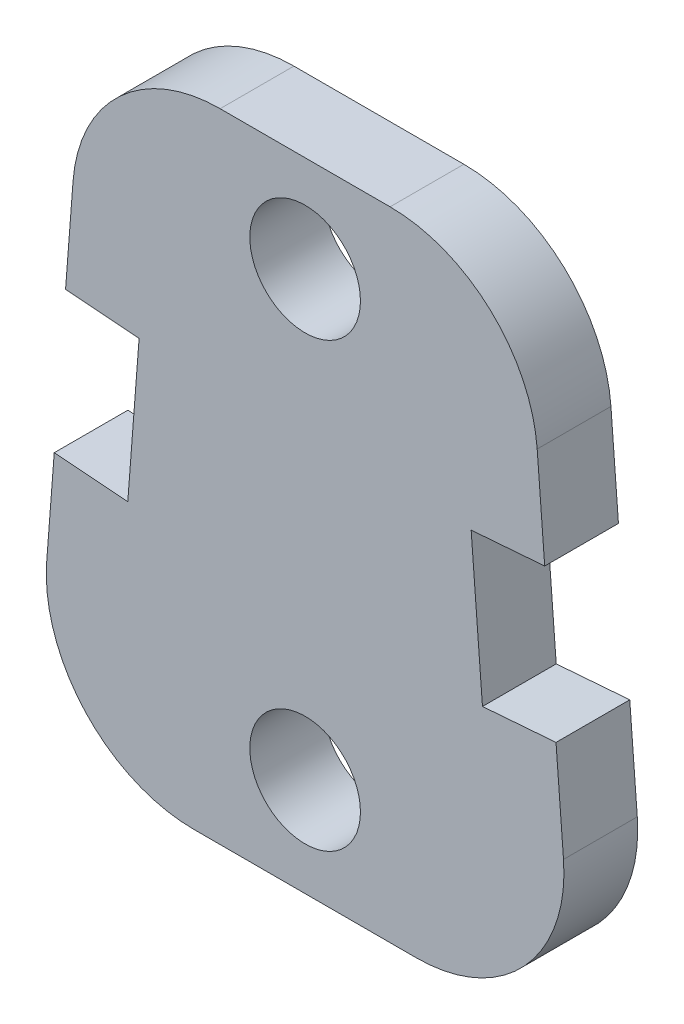
ISO-10303-21;
HEADER;
FILE_DESCRIPTION(('STEP AP214'),'2;1');
FILE_NAME('part.step','',(''),(''),'','','');
FILE_SCHEMA(('AUTOMOTIVE_DESIGN { 1 0 10303 214 1 1 1 1 }'));
ENDSEC;
DATA;
#1=APPLICATION_CONTEXT('core data for automotive mechanical design processes');
#2=APPLICATION_PROTOCOL_DEFINITION('international standard','automotive_design',2000,#1);
#3=PRODUCT_CONTEXT('',#1,'mechanical');
#4=PRODUCT('Part','Part','',(#3));
#5=PRODUCT_RELATED_PRODUCT_CATEGORY('part','',(#4));
#6=PRODUCT_DEFINITION_FORMATION('','',#4);
#7=PRODUCT_DEFINITION_CONTEXT('part definition',#1,'design');
#8=PRODUCT_DEFINITION('design','',#6,#7);
#9=PRODUCT_DEFINITION_SHAPE('','',#8);
#10=(LENGTH_UNIT() NAMED_UNIT(*) SI_UNIT(.MILLI.,.METRE.));
#11=(NAMED_UNIT(*) PLANE_ANGLE_UNIT() SI_UNIT($,.RADIAN.));
#12=(NAMED_UNIT(*) SI_UNIT($,.STERADIAN.) SOLID_ANGLE_UNIT());
#13=UNCERTAINTY_MEASURE_WITH_UNIT(LENGTH_MEASURE(1.E-05),#10,'distance_accuracy_value','');
#14=(GEOMETRIC_REPRESENTATION_CONTEXT(3) GLOBAL_UNCERTAINTY_ASSIGNED_CONTEXT((#13)) GLOBAL_UNIT_ASSIGNED_CONTEXT((#10,
#11,#12)) REPRESENTATION_CONTEXT('',''));
#15=CARTESIAN_POINT('',(0.,0.,0.));
#16=DIRECTION('',(0.,0.,1.));
#17=DIRECTION('',(1.,0.,0.));
#18=AXIS2_PLACEMENT_3D('',#15,#16,#17);
#19=CARTESIAN_POINT('',(0.,0.,3.175));
#20=DIRECTION('',(0.,0.,1.));
#21=DIRECTION('',(1.,0.,0.));
#22=AXIS2_PLACEMENT_3D('',#19,#20,#21);
#23=PLANE('',#22);
#24=CARTESIAN_POINT('',(0.,59.1820000846667,3.175));
#25=DIRECTION('',(0.,0.,1.));
#26=DIRECTION('',(1.,0.,0.));
#27=AXIS2_PLACEMENT_3D('',#24,#25,#26);
#28=CIRCLE('',#27,2.38125);
#29=CARTESIAN_POINT('',(2.38125,59.1820000846667,3.175));
#30=VERTEX_POINT('',#29);
#31=EDGE_CURVE('E196',#30,#30,#28,.T.);
#32=ORIENTED_EDGE('',*,*,#31,.F.);
#33=EDGE_LOOP('',(#32));
#34=FACE_BOUND('',#33,.T.);
#35=CARTESIAN_POINT('',(0.,78.2320000846667,3.175));
#36=DIRECTION('',(0.,0.,1.));
#37=DIRECTION('',(1.,0.,0.));
#38=AXIS2_PLACEMENT_3D('',#35,#36,#37);
#39=CIRCLE('',#38,2.38125);
#40=CARTESIAN_POINT('',(2.38125,78.2320000846667,3.175));
#41=VERTEX_POINT('',#40);
#42=EDGE_CURVE('E199',#41,#41,#39,.T.);
#43=ORIENTED_EDGE('',*,*,#42,.F.);
#44=EDGE_LOOP('',(#43));
#45=FACE_BOUND('',#44,.T.);
#46=DIRECTION('',(0.0766964988847375,-0.997054485501582,0.));
#47=VECTOR('',#46,1.);
#48=CARTESIAN_POINT('',(15.7816176470588,1.2139705882353,3.175));
#49=LINE('',#48,#47);
#50=CARTESIAN_POINT('',(10.7991506582218,65.9860414431172,3.17499999999999));
#51=VERTEX_POINT('',#50);
#52=CARTESIAN_POINT('',(11.1222546588781,61.7856894345848,3.175));
#53=VERTEX_POINT('',#52);
#54=EDGE_CURVE('E221',#51,#53,#49,.T.);
#55=ORIENTED_EDGE('',*,*,#54,.F.);
#56=DIRECTION('',(0.997054485501582,0.0766964988847376,0.));
#57=VECTOR('',#56,1.);
#58=CARTESIAN_POINT('',(7.63350266675425,65.7425300591581,3.17499999999999));
#59=LINE('',#58,#57);
#60=CARTESIAN_POINT('',(7.63350266675425,65.7425300591581,3.17499999999999));
#61=VERTEX_POINT('',#60);
#62=EDGE_CURVE('E166',#61,#51,#59,.T.);
#63=ORIENTED_EDGE('',*,*,#62,.F.);
#64=DIRECTION('',(0.0766964988847376,-0.997054485501582,0.));
#65=VECTOR('',#64,1.);
#66=CARTESIAN_POINT('',(12.6159696555914,0.970459204276265,3.175));
#67=LINE('',#66,#65);
#68=CARTESIAN_POINT('',(7.14647989883617,72.0738260420932,3.175));
#69=VERTEX_POINT('',#68);
#70=EDGE_CURVE('E171',#69,#61,#67,.T.);
#71=ORIENTED_EDGE('',*,*,#70,.F.);
#72=DIRECTION('',(0.997054485501582,0.0766964988847376,0.));
#73=VECTOR('',#72,1.);
#74=CARTESIAN_POINT('',(7.14647989883617,72.0738260420932,3.175));
#75=LINE('',#74,#73);
#76=CARTESIAN_POINT('',(10.3121278903037,72.3173374260522,3.175));
#77=VERTEX_POINT('',#76);
#78=EDGE_CURVE('E156',#69,#77,#75,.T.);
#79=ORIENTED_EDGE('',*,*,#78,.T.);
#80=CARTESIAN_POINT('',(9.98902388964729,76.5176894345847,3.175));
#81=VERTEX_POINT('',#80);
#82=EDGE_CURVE('E222',#81,#77,#49,.T.);
#83=ORIENTED_EDGE('',*,*,#82,.F.);
#84=CARTESIAN_POINT('',(3.65772790671225,76.0306666666667,3.175));
#85=DIRECTION('',(0.,0.,1.));
#86=DIRECTION('',(1.,0.,0.));
#87=AXIS2_PLACEMENT_3D('',#84,#85,#86);
#88=CIRCLE('',#87,6.35);
#89=CARTESIAN_POINT('',(3.65772790671221,82.3806666666667,3.175));
#90=VERTEX_POINT('',#89);
#91=EDGE_CURVE('E225',#81,#90,#88,.T.);
#92=ORIENTED_EDGE('',*,*,#91,.T.);
#93=DIRECTION('',(1.,0.,0.));
#94=VECTOR('',#93,1.);
#95=CARTESIAN_POINT('',(0.,82.3806666666667,3.175));
#96=LINE('',#95,#94);
#97=CARTESIAN_POINT('',(-3.65772790671228,82.3806666666667,3.175));
#98=VERTEX_POINT('',#97);
#99=EDGE_CURVE('E203',#98,#90,#96,.T.);
#100=ORIENTED_EDGE('',*,*,#99,.F.);
#101=CARTESIAN_POINT('',(-3.65772790671232,76.0306666666667,3.175));
#102=DIRECTION('',(0.,0.,1.));
#103=DIRECTION('',(1.,0.,0.));
#104=AXIS2_PLACEMENT_3D('',#101,#102,#103);
#105=CIRCLE('',#104,6.35);
#106=CARTESIAN_POINT('',(-9.98902388964737,76.5176894345847,3.175));
#107=VERTEX_POINT('',#106);
#108=EDGE_CURVE('E206',#98,#107,#105,.T.);
#109=ORIENTED_EDGE('',*,*,#108,.T.);
#110=DIRECTION('',(0.0766964988847366,0.997054485501582,0.));
#111=VECTOR('',#110,1.);
#112=CARTESIAN_POINT('',(-15.7816176470588,1.21397058823529,3.175));
#113=LINE('',#112,#111);
#114=CARTESIAN_POINT('',(-10.3121278903037,72.3173374260523,3.17500000000001));
#115=VERTEX_POINT('',#114);
#116=EDGE_CURVE('E209',#115,#107,#113,.T.);
#117=ORIENTED_EDGE('',*,*,#116,.F.);
#118=DIRECTION('',(0.997054485501581,-0.0766964988847419,0.));
#119=VECTOR('',#118,1.);
#120=CARTESIAN_POINT('',(-10.3121278903037,72.3173374260523,3.17500000000001));
#121=LINE('',#120,#119);
#122=CARTESIAN_POINT('',(-7.14647989883614,72.0738260420933,3.17500000000001));
#123=VERTEX_POINT('',#122);
#124=EDGE_CURVE('E186',#115,#123,#121,.T.);
#125=ORIENTED_EDGE('',*,*,#124,.T.);
#126=DIRECTION('',(-0.0766964988847419,-0.997054485501581,0.));
#127=VECTOR('',#126,1.);
#128=CARTESIAN_POINT('',(-12.6159696555916,0.970459204276341,3.175));
#129=LINE('',#128,#127);
#130=CARTESIAN_POINT('',(-7.63350266675425,65.7425300591583,3.17500000000001));
#131=VERTEX_POINT('',#130);
#132=EDGE_CURVE('E185',#123,#131,#129,.T.);
#133=ORIENTED_EDGE('',*,*,#132,.T.);
#134=DIRECTION('',(0.997054485501581,-0.0766964988847419,0.));
#135=VECTOR('',#134,1.);
#136=CARTESIAN_POINT('',(-10.7991506582218,65.9860414431173,3.17500000000001));
#137=LINE('',#136,#135);
#138=CARTESIAN_POINT('',(-10.7991506582218,65.9860414431173,3.17500000000001));
#139=VERTEX_POINT('',#138);
#140=EDGE_CURVE('E183',#139,#131,#137,.T.);
#141=ORIENTED_EDGE('',*,*,#140,.F.);
#142=CARTESIAN_POINT('',(-11.1222546588781,61.7856894345848,3.175));
#143=VERTEX_POINT('',#142);
#144=EDGE_CURVE('E210',#143,#139,#113,.T.);
#145=ORIENTED_EDGE('',*,*,#144,.F.);
#146=CARTESIAN_POINT('',(-4.79095867594309,61.2986666666667,3.175));
#147=DIRECTION('',(0.,0.,1.));
#148=DIRECTION('',(1.,0.,0.));
#149=AXIS2_PLACEMENT_3D('',#146,#147,#148);
#150=CIRCLE('',#149,6.35);
#151=CARTESIAN_POINT('',(-4.79095867594304,54.9486666666667,3.175));
#152=VERTEX_POINT('',#151);
#153=EDGE_CURVE('E213',#143,#152,#150,.T.);
#154=ORIENTED_EDGE('',*,*,#153,.T.);
#155=DIRECTION('',(1.,0.,0.));
#156=VECTOR('',#155,1.);
#157=CARTESIAN_POINT('',(0.,54.9486666666667,3.175));
#158=LINE('',#157,#156);
#159=CARTESIAN_POINT('',(4.79095867594297,54.9486666666667,3.175));
#160=VERTEX_POINT('',#159);
#161=EDGE_CURVE('E216',#152,#160,#158,.T.);
#162=ORIENTED_EDGE('',*,*,#161,.T.);
#163=CARTESIAN_POINT('',(4.79095867594302,61.2986666666667,3.175));
#164=DIRECTION('',(0.,0.,1.));
#165=DIRECTION('',(1.,0.,0.));
#166=AXIS2_PLACEMENT_3D('',#163,#164,#165);
#167=CIRCLE('',#166,6.35);
#168=EDGE_CURVE('E218',#53,#160,#167,.F.);
#169=ORIENTED_EDGE('',*,*,#168,.F.);
#170=EDGE_LOOP('',(#55,#63,#71,#79,#83,#92,#100,#109,#117,#125,#133,#141,#145,#154,#162,#169));
#171=FACE_BOUND('',#170,.T.);
#172=ADVANCED_FACE('F33',(#34,#45,#171),#23,.T.);
#173=CARTESIAN_POINT('',(15.7816176470588,1.2139705882353,3.175));
#174=DIRECTION('',(0.997054485501581,0.0766964988847374,0.));
#175=DIRECTION('',(-0.0766964988847375,0.997054485501582,0.));
#176=AXIS2_PLACEMENT_3D('',#173,#174,#175);
#177=PLANE('',#176);
#178=ORIENTED_EDGE('',*,*,#82,.T.);
#179=DIRECTION('',(0.,0.,-1.));
#180=VECTOR('',#179,1.);
#181=CARTESIAN_POINT('',(10.3121278903037,72.3173374260522,3.175));
#182=LINE('',#181,#180);
#183=CARTESIAN_POINT('',(10.3121278903037,72.3173374260522,0.));
#184=VERTEX_POINT('',#183);
#185=EDGE_CURVE('E310',#77,#184,#182,.T.);
#186=ORIENTED_EDGE('',*,*,#185,.T.);
#187=DIRECTION('',(0.0766964988847375,-0.997054485501582,0.));
#188=VECTOR('',#187,1.);
#189=CARTESIAN_POINT('',(15.7816176470588,1.2139705882353,0.));
#190=LINE('',#189,#188);
#191=CARTESIAN_POINT('',(9.98902388964729,76.5176894345847,0.));
#192=VERTEX_POINT('',#191);
#193=EDGE_CURVE('E164',#192,#184,#190,.T.);
#194=ORIENTED_EDGE('',*,*,#193,.F.);
#195=DIRECTION('',(0.,0.,-1.));
#196=VECTOR('',#195,1.);
#197=CARTESIAN_POINT('',(9.98902388964729,76.5176894345847,3.175));
#198=LINE('',#197,#196);
#199=EDGE_CURVE('E257',#81,#192,#198,.T.);
#200=ORIENTED_EDGE('',*,*,#199,.F.);
#201=EDGE_LOOP('',(#178,#186,#194,#200));
#202=FACE_BOUND('',#201,.T.);
#203=ADVANCED_FACE('F309',(#202),#177,.T.);
#204=CARTESIAN_POINT('',(-15.7816176470588,1.21397058823529,3.175));
#205=DIRECTION('',(-0.997054485501582,0.0766964988847366,0.));
#206=DIRECTION('',(-0.0766964988847366,-0.997054485501582,0.));
#207=AXIS2_PLACEMENT_3D('',#204,#205,#206);
#208=PLANE('',#207);
#209=DIRECTION('',(0.0766964988847366,0.997054485501582,0.));
#210=VECTOR('',#209,1.);
#211=CARTESIAN_POINT('',(-15.7816176470588,1.21397058823529,0.));
#212=LINE('',#211,#210);
#213=CARTESIAN_POINT('',(-10.3121278903037,72.3173374260523,0.));
#214=VERTEX_POINT('',#213);
#215=CARTESIAN_POINT('',(-9.98902388964737,76.5176894345847,0.));
#216=VERTEX_POINT('',#215);
#217=EDGE_CURVE('E239',#214,#216,#212,.T.);
#218=ORIENTED_EDGE('',*,*,#217,.F.);
#219=DIRECTION('',(0.,0.,-1.));
#220=VECTOR('',#219,1.);
#221=CARTESIAN_POINT('',(-10.3121278903037,72.3173374260523,3.17500000000001));
#222=LINE('',#221,#220);
#223=EDGE_CURVE('E177',#115,#214,#222,.T.);
#224=ORIENTED_EDGE('',*,*,#223,.F.);
#225=ORIENTED_EDGE('',*,*,#116,.T.);
#226=DIRECTION('',(0.,0.,-1.));
#227=VECTOR('',#226,1.);
#228=CARTESIAN_POINT('',(-9.98902388964737,76.5176894345847,3.175));
#229=LINE('',#228,#227);
#230=EDGE_CURVE('E269',#107,#216,#229,.T.);
#231=ORIENTED_EDGE('',*,*,#230,.T.);
#232=EDGE_LOOP('',(#218,#224,#225,#231));
#233=FACE_BOUND('',#232,.T.);
#234=ADVANCED_FACE('F295',(#233),#208,.T.);
#235=CARTESIAN_POINT('',(0.,82.3806666666667,3.175));
#236=DIRECTION('',(0.,1.,0.));
#237=DIRECTION('',(0.,0.,1.));
#238=AXIS2_PLACEMENT_3D('',#235,#236,#237);
#239=PLANE('',#238);
#240=DIRECTION('',(1.,0.,0.));
#241=VECTOR('',#240,1.);
#242=CARTESIAN_POINT('',(0.,82.3806666666667,0.));
#243=LINE('',#242,#241);
#244=CARTESIAN_POINT('',(-3.65772790671228,82.3806666666667,0.));
#245=VERTEX_POINT('',#244);
#246=CARTESIAN_POINT('',(3.65772790671221,82.3806666666667,0.));
#247=VERTEX_POINT('',#246);
#248=EDGE_CURVE('E233',#245,#247,#243,.T.);
#249=ORIENTED_EDGE('',*,*,#248,.F.);
#250=DIRECTION('',(0.,0.,-1.));
#251=VECTOR('',#250,1.);
#252=CARTESIAN_POINT('',(-3.65772790671228,82.3806666666667,3.175));
#253=LINE('',#252,#251);
#254=EDGE_CURVE('E272',#98,#245,#253,.T.);
#255=ORIENTED_EDGE('',*,*,#254,.F.);
#256=ORIENTED_EDGE('',*,*,#99,.T.);
#257=DIRECTION('',(0.,0.,-1.));
#258=VECTOR('',#257,1.);
#259=CARTESIAN_POINT('',(3.65772790671221,82.3806666666667,3.175));
#260=LINE('',#259,#258);
#261=EDGE_CURVE('E227',#90,#247,#260,.T.);
#262=ORIENTED_EDGE('',*,*,#261,.T.);
#263=EDGE_LOOP('',(#249,#255,#256,#262));
#264=FACE_BOUND('',#263,.T.);
#265=ADVANCED_FACE('F302',(#264),#239,.T.);
#266=CARTESIAN_POINT('',(-3.65772790671232,76.0306666666667,3.175));
#267=DIRECTION('',(0.,0.,-1.));
#268=DIRECTION('',(-1.,0.,0.));
#269=AXIS2_PLACEMENT_3D('',#266,#267,#268);
#270=CYLINDRICAL_SURFACE('',#269,6.35);
#271=CARTESIAN_POINT('',(-3.65772790671232,76.0306666666667,0.));
#272=DIRECTION('',(0.,0.,1.));
#273=DIRECTION('',(1.,0.,0.));
#274=AXIS2_PLACEMENT_3D('',#271,#272,#273);
#275=CIRCLE('',#274,6.35);
#276=EDGE_CURVE('E236',#245,#216,#275,.T.);
#277=ORIENTED_EDGE('',*,*,#276,.T.);
#278=ORIENTED_EDGE('',*,*,#230,.F.);
#279=ORIENTED_EDGE('',*,*,#108,.F.);
#280=ORIENTED_EDGE('',*,*,#254,.T.);
#281=EDGE_LOOP('',(#277,#278,#279,#280));
#282=FACE_BOUND('',#281,.T.);
#283=ADVANCED_FACE('F299',(#282),#270,.T.);
#284=DIRECTION('',(0.,0.,-1.));
#285=VECTOR('',#284,1.);
#286=CARTESIAN_POINT('',(-10.7991506582218,65.9860414431173,3.17500000000001));
#287=LINE('',#286,#285);
#288=CARTESIAN_POINT('',(-10.7991506582218,65.9860414431173,0.));
#289=VERTEX_POINT('',#288);
#290=EDGE_CURVE('E174',#139,#289,#287,.T.);
#291=ORIENTED_EDGE('',*,*,#290,.T.);
#292=CARTESIAN_POINT('',(-11.1222546588781,61.7856894345848,0.));
#293=VERTEX_POINT('',#292);
#294=EDGE_CURVE('E240',#293,#289,#212,.T.);
#295=ORIENTED_EDGE('',*,*,#294,.F.);
#296=DIRECTION('',(0.,0.,-1.));
#297=VECTOR('',#296,1.);
#298=CARTESIAN_POINT('',(-11.1222546588781,61.7856894345848,3.175));
#299=LINE('',#298,#297);
#300=EDGE_CURVE('E267',#143,#293,#299,.T.);
#301=ORIENTED_EDGE('',*,*,#300,.F.);
#302=ORIENTED_EDGE('',*,*,#144,.T.);
#303=EDGE_LOOP('',(#291,#295,#301,#302));
#304=FACE_BOUND('',#303,.T.);
#305=ADVANCED_FACE('F283',(#304),#208,.T.);
#306=CARTESIAN_POINT('',(-4.79095867594309,61.2986666666667,3.175));
#307=DIRECTION('',(0.,0.,-1.));
#308=DIRECTION('',(-1.,0.,0.));
#309=AXIS2_PLACEMENT_3D('',#306,#307,#308);
#310=CYLINDRICAL_SURFACE('',#309,6.35);
#311=CARTESIAN_POINT('',(-4.79095867594309,61.2986666666667,0.));
#312=DIRECTION('',(0.,0.,1.));
#313=DIRECTION('',(1.,0.,0.));
#314=AXIS2_PLACEMENT_3D('',#311,#312,#313);
#315=CIRCLE('',#314,6.35);
#316=CARTESIAN_POINT('',(-4.79095867594304,54.9486666666667,0.));
#317=VERTEX_POINT('',#316);
#318=EDGE_CURVE('E243',#293,#317,#315,.T.);
#319=ORIENTED_EDGE('',*,*,#318,.T.);
#320=DIRECTION('',(0.,0.,-1.));
#321=VECTOR('',#320,1.);
#322=CARTESIAN_POINT('',(-4.79095867594304,54.9486666666667,3.175));
#323=LINE('',#322,#321);
#324=EDGE_CURVE('E264',#152,#317,#323,.T.);
#325=ORIENTED_EDGE('',*,*,#324,.F.);
#326=ORIENTED_EDGE('',*,*,#153,.F.);
#327=ORIENTED_EDGE('',*,*,#300,.T.);
#328=EDGE_LOOP('',(#319,#325,#326,#327));
#329=FACE_BOUND('',#328,.T.);
#330=ADVANCED_FACE('F333',(#329),#310,.T.);
#331=CARTESIAN_POINT('',(0.,54.9486666666667,3.175));
#332=DIRECTION('',(0.,1.,0.));
#333=DIRECTION('',(0.,0.,1.));
#334=AXIS2_PLACEMENT_3D('',#331,#332,#333);
#335=PLANE('',#334);
#336=DIRECTION('',(1.,0.,0.));
#337=VECTOR('',#336,1.);
#338=CARTESIAN_POINT('',(0.,54.9486666666667,0.));
#339=LINE('',#338,#337);
#340=CARTESIAN_POINT('',(4.79095867594297,54.9486666666667,0.));
#341=VERTEX_POINT('',#340);
#342=EDGE_CURVE('E246',#317,#341,#339,.T.);
#343=ORIENTED_EDGE('',*,*,#342,.T.);
#344=DIRECTION('',(0.,0.,-1.));
#345=VECTOR('',#344,1.);
#346=CARTESIAN_POINT('',(4.79095867594297,54.9486666666667,3.175));
#347=LINE('',#346,#345);
#348=EDGE_CURVE('E262',#160,#341,#347,.T.);
#349=ORIENTED_EDGE('',*,*,#348,.F.);
#350=ORIENTED_EDGE('',*,*,#161,.F.);
#351=ORIENTED_EDGE('',*,*,#324,.T.);
#352=EDGE_LOOP('',(#343,#349,#350,#351));
#353=FACE_BOUND('',#352,.T.);
#354=ADVANCED_FACE('F331',(#353),#335,.F.);
#355=CARTESIAN_POINT('',(4.79095867594302,61.2986666666667,3.175));
#356=DIRECTION('',(0.,0.,-1.));
#357=DIRECTION('',(-1.,0.,0.));
#358=AXIS2_PLACEMENT_3D('',#355,#356,#357);
#359=CYLINDRICAL_SURFACE('',#358,6.35);
#360=CARTESIAN_POINT('',(4.79095867594302,61.2986666666667,0.));
#361=DIRECTION('',(0.,0.,1.));
#362=DIRECTION('',(1.,0.,0.));
#363=AXIS2_PLACEMENT_3D('',#360,#361,#362);
#364=CIRCLE('',#363,6.35);
#365=CARTESIAN_POINT('',(11.1222546588781,61.7856894345848,0.));
#366=VERTEX_POINT('',#365);
#367=EDGE_CURVE('E249',#366,#341,#364,.F.);
#368=ORIENTED_EDGE('',*,*,#367,.F.);
#369=DIRECTION('',(0.,0.,-1.));
#370=VECTOR('',#369,1.);
#371=CARTESIAN_POINT('',(11.1222546588781,61.7856894345848,3.175));
#372=LINE('',#371,#370);
#373=EDGE_CURVE('E259',#53,#366,#372,.T.);
#374=ORIENTED_EDGE('',*,*,#373,.F.);
#375=ORIENTED_EDGE('',*,*,#168,.T.);
#376=ORIENTED_EDGE('',*,*,#348,.T.);
#377=EDGE_LOOP('',(#368,#374,#375,#376));
#378=FACE_BOUND('',#377,.T.);
#379=ADVANCED_FACE('F328',(#378),#359,.T.);
#380=DIRECTION('',(0.,0.,-1.));
#381=VECTOR('',#380,1.);
#382=CARTESIAN_POINT('',(10.7991506582218,65.9860414431171,3.17499999999999));
#383=LINE('',#382,#381);
#384=CARTESIAN_POINT('',(10.7991506582218,65.9860414431171,0.));
#385=VERTEX_POINT('',#384);
#386=EDGE_CURVE('E312',#51,#385,#383,.T.);
#387=ORIENTED_EDGE('',*,*,#386,.F.);
#388=ORIENTED_EDGE('',*,*,#54,.T.);
#389=ORIENTED_EDGE('',*,*,#373,.T.);
#390=EDGE_CURVE('E252',#385,#366,#190,.T.);
#391=ORIENTED_EDGE('',*,*,#390,.F.);
#392=EDGE_LOOP('',(#387,#388,#389,#391));
#393=FACE_BOUND('',#392,.T.);
#394=ADVANCED_FACE('F322',(#393),#177,.T.);
#395=CARTESIAN_POINT('',(0.,78.2320000846667,3.175));
#396=DIRECTION('',(0.,0.,-1.));
#397=DIRECTION('',(-1.,0.,0.));
#398=AXIS2_PLACEMENT_3D('',#395,#396,#397);
#399=CYLINDRICAL_SURFACE('',#398,2.38125);
#400=ORIENTED_EDGE('',*,*,#42,.T.);
#401=EDGE_LOOP('',(#400));
#402=FACE_BOUND('',#401,.T.);
#403=CARTESIAN_POINT('',(0.,78.2320000846667,0.));
#404=DIRECTION('',(0.,0.,1.));
#405=DIRECTION('',(1.,0.,0.));
#406=AXIS2_PLACEMENT_3D('',#403,#404,#405);
#407=CIRCLE('',#406,2.38125);
#408=CARTESIAN_POINT('',(2.38125,78.2320000846667,0.));
#409=VERTEX_POINT('',#408);
#410=EDGE_CURVE('E230',#409,#409,#407,.T.);
#411=ORIENTED_EDGE('',*,*,#410,.F.);
#412=EDGE_LOOP('',(#411));
#413=FACE_BOUND('',#412,.T.);
#414=ADVANCED_FACE('F359',(#402,#413),#399,.F.);
#415=CARTESIAN_POINT('',(0.,59.1820000846667,3.175));
#416=DIRECTION('',(0.,0.,-1.));
#417=DIRECTION('',(-1.,0.,0.));
#418=AXIS2_PLACEMENT_3D('',#415,#416,#417);
#419=CYLINDRICAL_SURFACE('',#418,2.38125);
#420=ORIENTED_EDGE('',*,*,#31,.T.);
#421=EDGE_LOOP('',(#420));
#422=FACE_BOUND('',#421,.T.);
#423=CARTESIAN_POINT('',(0.,59.1820000846667,0.));
#424=DIRECTION('',(0.,0.,1.));
#425=DIRECTION('',(1.,0.,0.));
#426=AXIS2_PLACEMENT_3D('',#423,#424,#425);
#427=CIRCLE('',#426,2.38125);
#428=CARTESIAN_POINT('',(2.38125,59.1820000846667,0.));
#429=VERTEX_POINT('',#428);
#430=EDGE_CURVE('E195',#429,#429,#427,.T.);
#431=ORIENTED_EDGE('',*,*,#430,.F.);
#432=EDGE_LOOP('',(#431));
#433=FACE_BOUND('',#432,.T.);
#434=ADVANCED_FACE('F35',(#422,#433),#419,.F.);
#435=CARTESIAN_POINT('',(3.65772790671225,76.0306666666667,3.175));
#436=DIRECTION('',(0.,0.,-1.));
#437=DIRECTION('',(-1.,0.,0.));
#438=AXIS2_PLACEMENT_3D('',#435,#436,#437);
#439=CYLINDRICAL_SURFACE('',#438,6.35);
#440=CARTESIAN_POINT('',(3.65772790671225,76.0306666666667,0.));
#441=DIRECTION('',(0.,0.,1.));
#442=DIRECTION('',(1.,0.,0.));
#443=AXIS2_PLACEMENT_3D('',#440,#441,#442);
#444=CIRCLE('',#443,6.35);
#445=EDGE_CURVE('E200',#192,#247,#444,.T.);
#446=ORIENTED_EDGE('',*,*,#445,.T.);
#447=ORIENTED_EDGE('',*,*,#261,.F.);
#448=ORIENTED_EDGE('',*,*,#91,.F.);
#449=ORIENTED_EDGE('',*,*,#199,.T.);
#450=EDGE_LOOP('',(#446,#447,#448,#449));
#451=FACE_BOUND('',#450,.T.);
#452=ADVANCED_FACE('F307',(#451),#439,.T.);
#453=CARTESIAN_POINT('',(0.,0.,0.));
#454=DIRECTION('',(0.,0.,1.));
#455=DIRECTION('',(1.,0.,0.));
#456=AXIS2_PLACEMENT_3D('',#453,#454,#455);
#457=PLANE('',#456);
#458=ORIENTED_EDGE('',*,*,#445,.F.);
#459=ORIENTED_EDGE('',*,*,#193,.T.);
#460=DIRECTION('',(0.997054485501582,0.0766964988847376,0.));
#461=VECTOR('',#460,1.);
#462=CARTESIAN_POINT('',(7.14647989883617,72.0738260420932,0.));
#463=LINE('',#462,#461);
#464=CARTESIAN_POINT('',(7.14647989883617,72.0738260420932,0.));
#465=VERTEX_POINT('',#464);
#466=EDGE_CURVE('E153',#465,#184,#463,.T.);
#467=ORIENTED_EDGE('',*,*,#466,.F.);
#468=DIRECTION('',(0.0766964988847376,-0.997054485501582,0.));
#469=VECTOR('',#468,1.);
#470=CARTESIAN_POINT('',(12.6159696555914,0.970459204276265,0.));
#471=LINE('',#470,#469);
#472=CARTESIAN_POINT('',(7.63350266675425,65.7425300591581,0.));
#473=VERTEX_POINT('',#472);
#474=EDGE_CURVE('E11',#465,#473,#471,.T.);
#475=ORIENTED_EDGE('',*,*,#474,.T.);
#476=DIRECTION('',(0.997054485501582,0.0766964988847376,0.));
#477=VECTOR('',#476,1.);
#478=CARTESIAN_POINT('',(7.63350266675425,65.7425300591581,0.));
#479=LINE('',#478,#477);
#480=EDGE_CURVE('E157',#473,#385,#479,.T.);
#481=ORIENTED_EDGE('',*,*,#480,.T.);
#482=ORIENTED_EDGE('',*,*,#390,.T.);
#483=ORIENTED_EDGE('',*,*,#367,.T.);
#484=ORIENTED_EDGE('',*,*,#342,.F.);
#485=ORIENTED_EDGE('',*,*,#318,.F.);
#486=ORIENTED_EDGE('',*,*,#294,.T.);
#487=DIRECTION('',(0.997054485501581,-0.0766964988847419,0.));
#488=VECTOR('',#487,1.);
#489=CARTESIAN_POINT('',(-10.7991506582218,65.9860414431173,0.));
#490=LINE('',#489,#488);
#491=CARTESIAN_POINT('',(-7.63350266675425,65.7425300591582,0.));
#492=VERTEX_POINT('',#491);
#493=EDGE_CURVE('E179',#289,#492,#490,.T.);
#494=ORIENTED_EDGE('',*,*,#493,.T.);
#495=DIRECTION('',(-0.0766964988847419,-0.997054485501581,0.));
#496=VECTOR('',#495,1.);
#497=CARTESIAN_POINT('',(-12.6159696555916,0.970459204276341,0.));
#498=LINE('',#497,#496);
#499=CARTESIAN_POINT('',(-7.14647989883614,72.0738260420933,0.));
#500=VERTEX_POINT('',#499);
#501=EDGE_CURVE('E41',#500,#492,#498,.T.);
#502=ORIENTED_EDGE('',*,*,#501,.F.);
#503=DIRECTION('',(0.997054485501581,-0.0766964988847419,0.));
#504=VECTOR('',#503,1.);
#505=CARTESIAN_POINT('',(-10.3121278903037,72.3173374260523,0.));
#506=LINE('',#505,#504);
#507=EDGE_CURVE('E189',#214,#500,#506,.T.);
#508=ORIENTED_EDGE('',*,*,#507,.F.);
#509=ORIENTED_EDGE('',*,*,#217,.T.);
#510=ORIENTED_EDGE('',*,*,#276,.F.);
#511=ORIENTED_EDGE('',*,*,#248,.T.);
#512=EDGE_LOOP('',(#458,#459,#467,#475,#481,#482,#483,#484,#485,#486,#494,#502,#508,#509,#510,#511));
#513=FACE_BOUND('',#512,.T.);
#514=ORIENTED_EDGE('',*,*,#430,.T.);
#515=EDGE_LOOP('',(#514));
#516=FACE_BOUND('',#515,.T.);
#517=ORIENTED_EDGE('',*,*,#410,.T.);
#518=EDGE_LOOP('',(#517));
#519=FACE_BOUND('',#518,.T.);
#520=ADVANCED_FACE('F161',(#513,#516,#519),#457,.F.);
#521=CARTESIAN_POINT('',(-7.2664238699623,70.5145544174533,9.54135538663948));
#522=DIRECTION('',(-0.997054485501581,0.0766964988847419,0.));
#523=DIRECTION('',(0.,0.,1.));
#524=AXIS2_PLACEMENT_3D('',#521,#522,#523);
#525=PLANE('',#524);
#526=DIRECTION('',(0.,0.,-1.));
#527=VECTOR('',#526,1.);
#528=CARTESIAN_POINT('',(-7.14647989883614,72.0738260420933,3.17500000000001));
#529=LINE('',#528,#527);
#530=EDGE_CURVE('E56',#123,#500,#529,.T.);
#531=ORIENTED_EDGE('',*,*,#530,.T.);
#532=ORIENTED_EDGE('',*,*,#501,.T.);
#533=DIRECTION('',(0.,0.,-1.));
#534=VECTOR('',#533,1.);
#535=CARTESIAN_POINT('',(-7.63350266675425,65.7425300591582,3.17500000000001));
#536=LINE('',#535,#534);
#537=EDGE_CURVE('E173',#131,#492,#536,.T.);
#538=ORIENTED_EDGE('',*,*,#537,.F.);
#539=ORIENTED_EDGE('',*,*,#132,.F.);
#540=EDGE_LOOP('',(#531,#532,#538,#539));
#541=FACE_BOUND('',#540,.T.);
#542=ADVANCED_FACE('F275',(#541),#525,.T.);
#543=CARTESIAN_POINT('',(-10.7991506582218,65.9860414431173,3.17500000000001));
#544=DIRECTION('',(-0.076696498884742,-0.997054485501581,0.));
#545=DIRECTION('',(-0.997054485501581,0.0766964988847419,0.));
#546=AXIS2_PLACEMENT_3D('',#543,#544,#545);
#547=PLANE('',#546);
#548=ORIENTED_EDGE('',*,*,#537,.T.);
#549=ORIENTED_EDGE('',*,*,#493,.F.);
#550=ORIENTED_EDGE('',*,*,#290,.F.);
#551=ORIENTED_EDGE('',*,*,#140,.T.);
#552=EDGE_LOOP('',(#548,#549,#550,#551));
#553=FACE_BOUND('',#552,.T.);
#554=ADVANCED_FACE('F278',(#553),#547,.F.);
#555=CARTESIAN_POINT('',(-10.3121278903037,72.3173374260523,3.17500000000001));
#556=DIRECTION('',(-0.076696498884742,-0.997054485501581,0.));
#557=DIRECTION('',(-0.997054485501581,0.0766964988847419,0.));
#558=AXIS2_PLACEMENT_3D('',#555,#556,#557);
#559=PLANE('',#558);
#560=ORIENTED_EDGE('',*,*,#530,.F.);
#561=ORIENTED_EDGE('',*,*,#124,.F.);
#562=ORIENTED_EDGE('',*,*,#223,.T.);
#563=ORIENTED_EDGE('',*,*,#507,.T.);
#564=EDGE_LOOP('',(#560,#561,#562,#563));
#565=FACE_BOUND('',#564,.T.);
#566=ADVANCED_FACE('F290',(#565),#559,.T.);
#567=CARTESIAN_POINT('',(7.26642386996232,70.5145544174532,9.54135538663947));
#568=DIRECTION('',(-0.997054485501582,-0.0766964988847376,0.));
#569=DIRECTION('',(0.,0.,1.));
#570=AXIS2_PLACEMENT_3D('',#567,#568,#569);
#571=PLANE('',#570);
#572=ORIENTED_EDGE('',*,*,#70,.T.);
#573=DIRECTION('',(0.,0.,-1.));
#574=VECTOR('',#573,1.);
#575=CARTESIAN_POINT('',(7.63350266675425,65.7425300591581,3.17499999999999));
#576=LINE('',#575,#574);
#577=EDGE_CURVE('E48',#61,#473,#576,.T.);
#578=ORIENTED_EDGE('',*,*,#577,.T.);
#579=ORIENTED_EDGE('',*,*,#474,.F.);
#580=DIRECTION('',(0.,0.,-1.));
#581=VECTOR('',#580,1.);
#582=CARTESIAN_POINT('',(7.14647989883617,72.0738260420932,3.17499999999999));
#583=LINE('',#582,#581);
#584=EDGE_CURVE('E146',#69,#465,#583,.T.);
#585=ORIENTED_EDGE('',*,*,#584,.F.);
#586=EDGE_LOOP('',(#572,#578,#579,#585));
#587=FACE_BOUND('',#586,.T.);
#588=ADVANCED_FACE('F145',(#587),#571,.F.);
#589=CARTESIAN_POINT('',(7.63350266675425,65.7425300591581,3.17499999999999));
#590=DIRECTION('',(0.0766964988847375,-0.997054485501581,0.));
#591=DIRECTION('',(-0.997054485501582,-0.0766964988847376,0.));
#592=AXIS2_PLACEMENT_3D('',#589,#590,#591);
#593=PLANE('',#592);
#594=ORIENTED_EDGE('',*,*,#386,.T.);
#595=ORIENTED_EDGE('',*,*,#480,.F.);
#596=ORIENTED_EDGE('',*,*,#577,.F.);
#597=ORIENTED_EDGE('',*,*,#62,.T.);
#598=EDGE_LOOP('',(#594,#595,#596,#597));
#599=FACE_BOUND('',#598,.T.);
#600=ADVANCED_FACE('F319',(#599),#593,.F.);
#601=CARTESIAN_POINT('',(7.14647989883617,72.0738260420932,3.17499999999999));
#602=DIRECTION('',(0.0766964988847375,-0.997054485501581,0.));
#603=DIRECTION('',(-0.997054485501582,-0.0766964988847376,0.));
#604=AXIS2_PLACEMENT_3D('',#601,#602,#603);
#605=PLANE('',#604);
#606=ORIENTED_EDGE('',*,*,#185,.F.);
#607=ORIENTED_EDGE('',*,*,#78,.F.);
#608=ORIENTED_EDGE('',*,*,#584,.T.);
#609=ORIENTED_EDGE('',*,*,#466,.T.);
#610=EDGE_LOOP('',(#606,#607,#608,#609));
#611=FACE_BOUND('',#610,.T.);
#612=ADVANCED_FACE('F152',(#611),#605,.T.);
#613=CLOSED_SHELL('',(#172,#203,#234,#265,#283,#305,#330,#354,#379,#394,#414,#434,#452,#520,
#542,#554,#566,#588,#600,#612));
#614=MANIFOLD_SOLID_BREP('B2',#613);
#615=ADVANCED_BREP_SHAPE_REPRESENTATION('',(#18,#614),#14);
#616=SHAPE_DEFINITION_REPRESENTATION(#9,#615);
ENDSEC;
END-ISO-10303-21;
